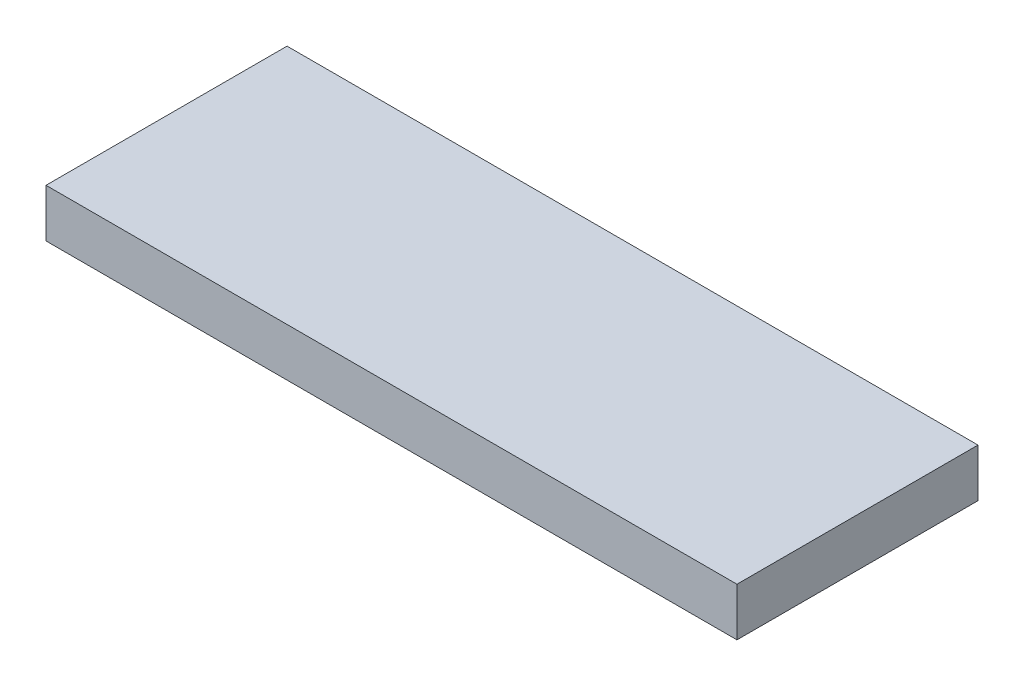
ISO-10303-21;
HEADER;
FILE_DESCRIPTION(('STEP AP214'),'2;1');
FILE_NAME('part.step','',(''),(''),'','','');
FILE_SCHEMA(('AUTOMOTIVE_DESIGN { 1 0 10303 214 1 1 1 1 }'));
ENDSEC;
DATA;
#1=APPLICATION_CONTEXT('core data for automotive mechanical design processes');
#2=APPLICATION_PROTOCOL_DEFINITION('international standard','automotive_design',2000,#1);
#3=PRODUCT_CONTEXT('',#1,'mechanical');
#4=PRODUCT('Part','Part','',(#3));
#5=PRODUCT_RELATED_PRODUCT_CATEGORY('part','',(#4));
#6=PRODUCT_DEFINITION_FORMATION('','',#4);
#7=PRODUCT_DEFINITION_CONTEXT('part definition',#1,'design');
#8=PRODUCT_DEFINITION('design','',#6,#7);
#9=PRODUCT_DEFINITION_SHAPE('','',#8);
#10=(LENGTH_UNIT() NAMED_UNIT(*) SI_UNIT(.MILLI.,.METRE.));
#11=(NAMED_UNIT(*) PLANE_ANGLE_UNIT() SI_UNIT($,.RADIAN.));
#12=(NAMED_UNIT(*) SI_UNIT($,.STERADIAN.) SOLID_ANGLE_UNIT());
#13=UNCERTAINTY_MEASURE_WITH_UNIT(LENGTH_MEASURE(1.E-05),#10,'distance_accuracy_value','');
#14=(GEOMETRIC_REPRESENTATION_CONTEXT(3) GLOBAL_UNCERTAINTY_ASSIGNED_CONTEXT((#13)) GLOBAL_UNIT_ASSIGNED_CONTEXT((#10,
#11,#12)) REPRESENTATION_CONTEXT('',''));
#15=CARTESIAN_POINT('',(0.,0.,0.));
#16=DIRECTION('',(0.,0.,1.));
#17=DIRECTION('',(1.,0.,0.));
#18=AXIS2_PLACEMENT_3D('',#15,#16,#17);
#19=CARTESIAN_POINT('',(21.5,1.5,7.5));
#20=DIRECTION('',(-1.,0.,0.));
#21=DIRECTION('',(0.,0.,1.));
#22=AXIS2_PLACEMENT_3D('',#19,#20,#21);
#23=PLANE('',#22);
#24=DIRECTION('',(0.,0.,-1.));
#25=VECTOR('',#24,1.);
#26=CARTESIAN_POINT('',(21.5,-1.5,7.5));
#27=LINE('',#26,#25);
#28=CARTESIAN_POINT('',(21.5,-1.5,7.5));
#29=VERTEX_POINT('',#28);
#30=CARTESIAN_POINT('',(21.5,-1.5,-7.5));
#31=VERTEX_POINT('',#30);
#32=EDGE_CURVE('E102',#29,#31,#27,.T.);
#33=ORIENTED_EDGE('',*,*,#32,.T.);
#34=DIRECTION('',(0.,-1.,0.));
#35=VECTOR('',#34,1.);
#36=CARTESIAN_POINT('',(21.5,1.5,-7.5));
#37=LINE('',#36,#35);
#38=CARTESIAN_POINT('',(21.5,1.5,-7.5));
#39=VERTEX_POINT('',#38);
#40=EDGE_CURVE('E11',#39,#31,#37,.T.);
#41=ORIENTED_EDGE('',*,*,#40,.F.);
#42=DIRECTION('',(0.,0.,-1.));
#43=VECTOR('',#42,1.);
#44=CARTESIAN_POINT('',(21.5,1.5,7.5));
#45=LINE('',#44,#43);
#46=CARTESIAN_POINT('',(21.5,1.5,7.5));
#47=VERTEX_POINT('',#46);
#48=EDGE_CURVE('E90',#47,#39,#45,.T.);
#49=ORIENTED_EDGE('',*,*,#48,.F.);
#50=DIRECTION('',(0.,-1.,0.));
#51=VECTOR('',#50,1.);
#52=CARTESIAN_POINT('',(21.5,1.5,7.5));
#53=LINE('',#52,#51);
#54=EDGE_CURVE('E98',#47,#29,#53,.T.);
#55=ORIENTED_EDGE('',*,*,#54,.T.);
#56=EDGE_LOOP('',(#33,#41,#49,#55));
#57=FACE_BOUND('',#56,.T.);
#58=ADVANCED_FACE('F39',(#57),#23,.F.);
#59=CARTESIAN_POINT('',(-21.5,1.5,-7.5));
#60=DIRECTION('',(0.,0.,1.));
#61=DIRECTION('',(1.,0.,0.));
#62=AXIS2_PLACEMENT_3D('',#59,#60,#61);
#63=PLANE('',#62);
#64=DIRECTION('',(-1.,0.,0.));
#65=VECTOR('',#64,1.);
#66=CARTESIAN_POINT('',(-21.5,-1.5,-7.5));
#67=LINE('',#66,#65);
#68=CARTESIAN_POINT('',(-21.5,-1.5,-7.5));
#69=VERTEX_POINT('',#68);
#70=EDGE_CURVE('E94',#31,#69,#67,.T.);
#71=ORIENTED_EDGE('',*,*,#70,.T.);
#72=DIRECTION('',(0.,-1.,0.));
#73=VECTOR('',#72,1.);
#74=CARTESIAN_POINT('',(-21.5,1.5,-7.5));
#75=LINE('',#74,#73);
#76=CARTESIAN_POINT('',(-21.5,1.5,-7.5));
#77=VERTEX_POINT('',#76);
#78=EDGE_CURVE('E47',#77,#69,#75,.T.);
#79=ORIENTED_EDGE('',*,*,#78,.F.);
#80=DIRECTION('',(-1.,0.,0.));
#81=VECTOR('',#80,1.);
#82=CARTESIAN_POINT('',(-21.5,1.5,-7.5));
#83=LINE('',#82,#81);
#84=EDGE_CURVE('E85',#39,#77,#83,.T.);
#85=ORIENTED_EDGE('',*,*,#84,.F.);
#86=ORIENTED_EDGE('',*,*,#40,.T.);
#87=EDGE_LOOP('',(#71,#79,#85,#86));
#88=FACE_BOUND('',#87,.T.);
#89=ADVANCED_FACE('F93',(#88),#63,.F.);
#90=CARTESIAN_POINT('',(-21.5,1.5,7.5));
#91=DIRECTION('',(1.,0.,0.));
#92=DIRECTION('',(0.,0.,-1.));
#93=AXIS2_PLACEMENT_3D('',#90,#91,#92);
#94=PLANE('',#93);
#95=DIRECTION('',(0.,0.,1.));
#96=VECTOR('',#95,1.);
#97=CARTESIAN_POINT('',(-21.5,-1.5,7.5));
#98=LINE('',#97,#96);
#99=CARTESIAN_POINT('',(-21.5,-1.5,7.5));
#100=VERTEX_POINT('',#99);
#101=EDGE_CURVE('E72',#69,#100,#98,.T.);
#102=ORIENTED_EDGE('',*,*,#101,.T.);
#103=DIRECTION('',(0.,-1.,0.));
#104=VECTOR('',#103,1.);
#105=CARTESIAN_POINT('',(-21.5,1.5,7.5));
#106=LINE('',#105,#104);
#107=CARTESIAN_POINT('',(-21.5,1.5,7.5));
#108=VERTEX_POINT('',#107);
#109=EDGE_CURVE('E95',#108,#100,#106,.T.);
#110=ORIENTED_EDGE('',*,*,#109,.F.);
#111=DIRECTION('',(0.,0.,1.));
#112=VECTOR('',#111,1.);
#113=CARTESIAN_POINT('',(-21.5,1.5,7.5));
#114=LINE('',#113,#112);
#115=EDGE_CURVE('E88',#77,#108,#114,.T.);
#116=ORIENTED_EDGE('',*,*,#115,.F.);
#117=ORIENTED_EDGE('',*,*,#78,.T.);
#118=EDGE_LOOP('',(#102,#110,#116,#117));
#119=FACE_BOUND('',#118,.T.);
#120=ADVANCED_FACE('F96',(#119),#94,.F.);
#121=CARTESIAN_POINT('',(-21.5,1.5,7.5));
#122=DIRECTION('',(0.,0.,-1.));
#123=DIRECTION('',(-1.,0.,0.));
#124=AXIS2_PLACEMENT_3D('',#121,#122,#123);
#125=PLANE('',#124);
#126=DIRECTION('',(1.,0.,0.));
#127=VECTOR('',#126,1.);
#128=CARTESIAN_POINT('',(-21.5,-1.5,7.5));
#129=LINE('',#128,#127);
#130=EDGE_CURVE('E78',#100,#29,#129,.T.);
#131=ORIENTED_EDGE('',*,*,#130,.T.);
#132=ORIENTED_EDGE('',*,*,#54,.F.);
#133=DIRECTION('',(1.,0.,0.));
#134=VECTOR('',#133,1.);
#135=CARTESIAN_POINT('',(-21.5,1.5,7.5));
#136=LINE('',#135,#134);
#137=EDGE_CURVE('E55',#108,#47,#136,.T.);
#138=ORIENTED_EDGE('',*,*,#137,.F.);
#139=ORIENTED_EDGE('',*,*,#109,.T.);
#140=EDGE_LOOP('',(#131,#132,#138,#139));
#141=FACE_BOUND('',#140,.T.);
#142=ADVANCED_FACE('F109',(#141),#125,.F.);
#143=CARTESIAN_POINT('',(0.,1.5,0.));
#144=DIRECTION('',(0.,-1.,0.));
#145=DIRECTION('',(0.,0.,-1.));
#146=AXIS2_PLACEMENT_3D('',#143,#144,#145);
#147=PLANE('',#146);
#148=ORIENTED_EDGE('',*,*,#48,.T.);
#149=ORIENTED_EDGE('',*,*,#84,.T.);
#150=ORIENTED_EDGE('',*,*,#115,.T.);
#151=ORIENTED_EDGE('',*,*,#137,.T.);
#152=EDGE_LOOP('',(#148,#149,#150,#151));
#153=FACE_BOUND('',#152,.T.);
#154=ADVANCED_FACE('F86',(#153),#147,.F.);
#155=CARTESIAN_POINT('',(0.,-1.5,0.));
#156=DIRECTION('',(0.,-1.,0.));
#157=DIRECTION('',(0.,0.,-1.));
#158=AXIS2_PLACEMENT_3D('',#155,#156,#157);
#159=PLANE('',#158);
#160=ORIENTED_EDGE('',*,*,#32,.F.);
#161=ORIENTED_EDGE('',*,*,#130,.F.);
#162=ORIENTED_EDGE('',*,*,#101,.F.);
#163=ORIENTED_EDGE('',*,*,#70,.F.);
#164=EDGE_LOOP('',(#160,#161,#162,#163));
#165=FACE_BOUND('',#164,.T.);
#166=ADVANCED_FACE('F112',(#165),#159,.T.);
#167=CLOSED_SHELL('',(#58,#89,#120,#142,#154,#166));
#168=MANIFOLD_SOLID_BREP('B2',#167);
#169=ADVANCED_BREP_SHAPE_REPRESENTATION('',(#18,#168),#14);
#170=SHAPE_DEFINITION_REPRESENTATION(#9,#169);
ENDSEC;
END-ISO-10303-21;
